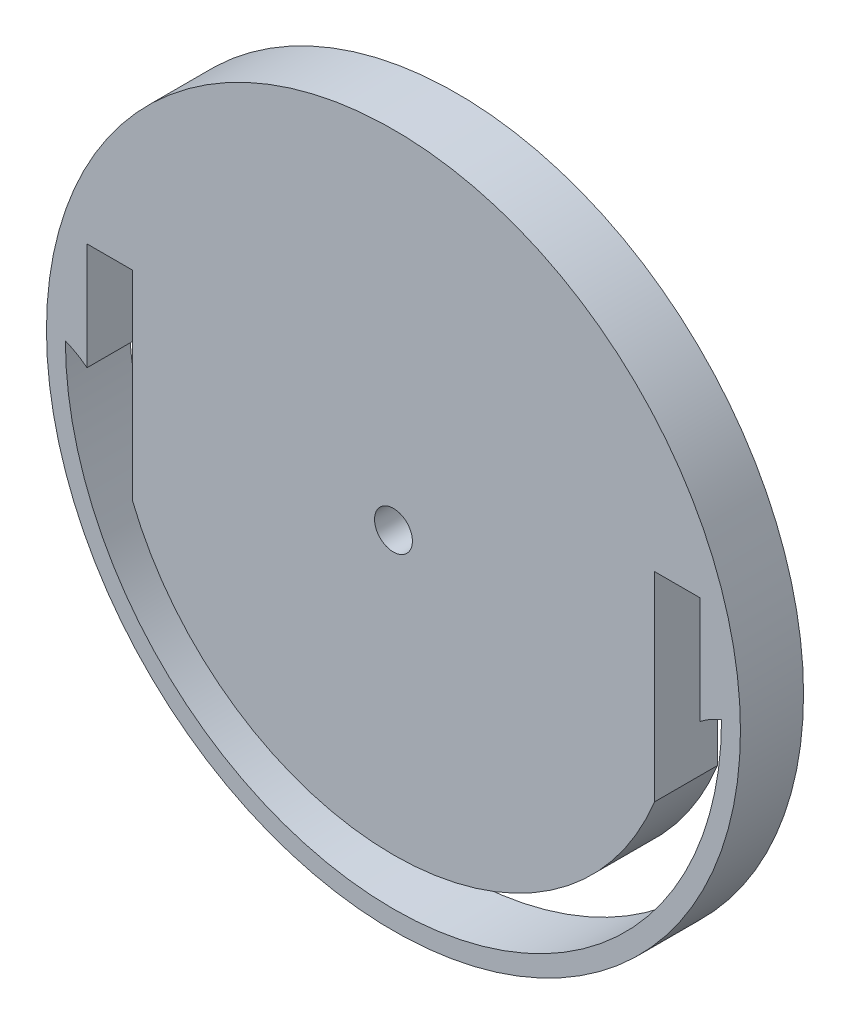
ISO-10303-21;
HEADER;
FILE_DESCRIPTION(('STEP AP214'),'2;1');
FILE_NAME('part.step','',(''),(''),'','','');
FILE_SCHEMA(('AUTOMOTIVE_DESIGN { 1 0 10303 214 1 1 1 1 }'));
ENDSEC;
DATA;
#1=APPLICATION_CONTEXT('core data for automotive mechanical design processes');
#2=APPLICATION_PROTOCOL_DEFINITION('international standard','automotive_design',2000,#1);
#3=PRODUCT_CONTEXT('',#1,'mechanical');
#4=PRODUCT('Part','Part','',(#3));
#5=PRODUCT_RELATED_PRODUCT_CATEGORY('part','',(#4));
#6=PRODUCT_DEFINITION_FORMATION('','',#4);
#7=PRODUCT_DEFINITION_CONTEXT('part definition',#1,'design');
#8=PRODUCT_DEFINITION('design','',#6,#7);
#9=PRODUCT_DEFINITION_SHAPE('','',#8);
#10=(LENGTH_UNIT() NAMED_UNIT(*) SI_UNIT(.MILLI.,.METRE.));
#11=(NAMED_UNIT(*) PLANE_ANGLE_UNIT() SI_UNIT($,.RADIAN.));
#12=(NAMED_UNIT(*) SI_UNIT($,.STERADIAN.) SOLID_ANGLE_UNIT());
#13=UNCERTAINTY_MEASURE_WITH_UNIT(LENGTH_MEASURE(1.E-05),#10,'distance_accuracy_value','');
#14=(GEOMETRIC_REPRESENTATION_CONTEXT(3) GLOBAL_UNCERTAINTY_ASSIGNED_CONTEXT((#13)) GLOBAL_UNIT_ASSIGNED_CONTEXT((#10,
#11,#12)) REPRESENTATION_CONTEXT('',''));
#15=CARTESIAN_POINT('',(0.,0.,0.));
#16=DIRECTION('',(0.,0.,1.));
#17=DIRECTION('',(1.,0.,0.));
#18=AXIS2_PLACEMENT_3D('',#15,#16,#17);
#19=CARTESIAN_POINT('',(0.,0.,10.));
#20=DIRECTION('',(0.,0.,1.));
#21=DIRECTION('',(1.,0.,0.));
#22=AXIS2_PLACEMENT_3D('',#19,#20,#21);
#23=PLANE('',#22);
#24=CARTESIAN_POINT('',(-57.2847291763101,-13.1870036528318,10.));
#25=DIRECTION('',(0.,0.,1.));
#26=DIRECTION('',(1.,0.,0.));
#27=AXIS2_PLACEMENT_3D('',#24,#25,#26);
#28=CIRCLE('',#27,14.2065276477661);
#29=CARTESIAN_POINT('',(-48.5619502084647,-1.97368323090248,10.));
#30=VERTEX_POINT('',#29);
#31=CARTESIAN_POINT('',(-52.,0.,10.));
#32=VERTEX_POINT('',#31);
#33=EDGE_CURVE('E48',#30,#32,#28,.T.);
#34=ORIENTED_EDGE('',*,*,#33,.F.);
#35=DIRECTION('',(0.,-1.,0.));
#36=VECTOR('',#35,1.);
#37=CARTESIAN_POINT('',(-48.5619502084647,15.0195117266793,10.));
#38=LINE('',#37,#36);
#39=CARTESIAN_POINT('',(-48.5619502084647,15.0195117266793,10.));
#40=VERTEX_POINT('',#39);
#41=EDGE_CURVE('E129',#40,#30,#38,.T.);
#42=ORIENTED_EDGE('',*,*,#41,.F.);
#43=DIRECTION('',(-1.,0.,0.));
#44=VECTOR('',#43,1.);
#45=CARTESIAN_POINT('',(-48.5619502084647,15.0195117266793,10.));
#46=LINE('',#45,#44);
#47=CARTESIAN_POINT('',(-41.3619502084647,15.0195117266793,10.));
#48=VERTEX_POINT('',#47);
#49=EDGE_CURVE('E132',#48,#40,#46,.T.);
#50=ORIENTED_EDGE('',*,*,#49,.F.);
#51=DIRECTION('',(0.,1.,0.));
#52=VECTOR('',#51,1.);
#53=CARTESIAN_POINT('',(-41.3619502084647,15.0195117266793,10.));
#54=LINE('',#53,#52);
#55=CARTESIAN_POINT('',(-41.3619502084647,-16.6207117877179,10.));
#56=VERTEX_POINT('',#55);
#57=EDGE_CURVE('E172',#56,#48,#54,.T.);
#58=ORIENTED_EDGE('',*,*,#57,.F.);
#59=CARTESIAN_POINT('',(0.,0.,10.));
#60=DIRECTION('',(0.,0.,-1.));
#61=DIRECTION('',(1.,0.,0.));
#62=AXIS2_PLACEMENT_3D('',#59,#60,#61);
#63=CIRCLE('',#62,44.5764398015129);
#64=CARTESIAN_POINT('',(41.3619502084647,-16.6207117877179,10.));
#65=VERTEX_POINT('',#64);
#66=EDGE_CURVE('E169',#65,#56,#63,.T.);
#67=ORIENTED_EDGE('',*,*,#66,.F.);
#68=DIRECTION('',(0.,-1.,0.));
#69=VECTOR('',#68,1.);
#70=CARTESIAN_POINT('',(41.3619502084647,15.0195117266793,10.));
#71=LINE('',#70,#69);
#72=CARTESIAN_POINT('',(41.3619502084647,15.0195117266793,10.));
#73=VERTEX_POINT('',#72);
#74=EDGE_CURVE('E166',#73,#65,#71,.T.);
#75=ORIENTED_EDGE('',*,*,#74,.F.);
#76=DIRECTION('',(-1.,0.,0.));
#77=VECTOR('',#76,1.);
#78=CARTESIAN_POINT('',(48.5619502084647,15.0195117266793,10.));
#79=LINE('',#78,#77);
#80=CARTESIAN_POINT('',(48.5619502084647,15.0195117266793,10.));
#81=VERTEX_POINT('',#80);
#82=EDGE_CURVE('E163',#81,#73,#79,.T.);
#83=ORIENTED_EDGE('',*,*,#82,.F.);
#84=DIRECTION('',(0.,1.,0.));
#85=VECTOR('',#84,1.);
#86=CARTESIAN_POINT('',(48.5619502084647,15.0195117266793,10.));
#87=LINE('',#86,#85);
#88=CARTESIAN_POINT('',(48.5619502084647,-1.97368323090248,10.));
#89=VERTEX_POINT('',#88);
#90=EDGE_CURVE('E160',#89,#81,#87,.T.);
#91=ORIENTED_EDGE('',*,*,#90,.F.);
#92=CARTESIAN_POINT('',(57.2847291763101,-13.1870036528318,10.));
#93=DIRECTION('',(0.,0.,1.));
#94=DIRECTION('',(-1.,0.,0.));
#95=AXIS2_PLACEMENT_3D('',#92,#93,#94);
#96=CIRCLE('',#95,14.2065276477661);
#97=CARTESIAN_POINT('',(52.,0.,10.));
#98=VERTEX_POINT('',#97);
#99=EDGE_CURVE('E157',#98,#89,#96,.T.);
#100=ORIENTED_EDGE('',*,*,#99,.F.);
#101=CARTESIAN_POINT('',(0.,0.,10.));
#102=DIRECTION('',(0.,0.,1.));
#103=DIRECTION('',(1.,0.,0.));
#104=AXIS2_PLACEMENT_3D('',#101,#102,#103);
#105=CIRCLE('',#104,52.);
#106=EDGE_CURVE('E155',#32,#98,#105,.T.);
#107=ORIENTED_EDGE('',*,*,#106,.F.);
#108=EDGE_LOOP('',(#34,#42,#50,#58,#67,#75,#83,#91,#100,#107));
#109=FACE_BOUND('',#108,.T.);
#110=CARTESIAN_POINT('',(0.,0.,10.));
#111=DIRECTION('',(0.,0.,1.));
#112=DIRECTION('',(1.,0.,0.));
#113=AXIS2_PLACEMENT_3D('',#110,#111,#112);
#114=CIRCLE('',#113,55.);
#115=CARTESIAN_POINT('',(55.,0.,10.));
#116=VERTEX_POINT('',#115);
#117=EDGE_CURVE('E11',#116,#116,#114,.T.);
#118=ORIENTED_EDGE('',*,*,#117,.T.);
#119=EDGE_LOOP('',(#118));
#120=FACE_BOUND('',#119,.T.);
#121=CARTESIAN_POINT('',(0.,0.,10.));
#122=DIRECTION('',(0.,0.,1.));
#123=DIRECTION('',(1.,0.,0.));
#124=AXIS2_PLACEMENT_3D('',#121,#122,#123);
#125=CIRCLE('',#124,3.);
#126=CARTESIAN_POINT('',(3.,0.,10.));
#127=VERTEX_POINT('',#126);
#128=EDGE_CURVE('E195',#127,#127,#125,.T.);
#129=ORIENTED_EDGE('',*,*,#128,.F.);
#130=EDGE_LOOP('',(#129));
#131=FACE_BOUND('',#130,.T.);
#132=ADVANCED_FACE('F33',(#109,#120,#131),#23,.T.);
#133=CARTESIAN_POINT('',(0.,0.,0.));
#134=DIRECTION('',(0.,0.,1.));
#135=DIRECTION('',(1.,0.,0.));
#136=AXIS2_PLACEMENT_3D('',#133,#134,#135);
#137=PLANE('',#136);
#138=DIRECTION('',(0.,-1.,0.));
#139=VECTOR('',#138,1.);
#140=CARTESIAN_POINT('',(-48.5619502084647,15.0195117266793,0.));
#141=LINE('',#140,#139);
#142=CARTESIAN_POINT('',(-48.5619502084647,15.0195117266793,0.));
#143=VERTEX_POINT('',#142);
#144=CARTESIAN_POINT('',(-48.5619502084647,-1.97368323090248,0.));
#145=VERTEX_POINT('',#144);
#146=EDGE_CURVE('E118',#143,#145,#141,.T.);
#147=ORIENTED_EDGE('',*,*,#146,.T.);
#148=CARTESIAN_POINT('',(-57.2847291763101,-13.1870036528318,0.));
#149=DIRECTION('',(0.,0.,1.));
#150=DIRECTION('',(1.,0.,0.));
#151=AXIS2_PLACEMENT_3D('',#148,#149,#150);
#152=CIRCLE('',#151,14.2065276477661);
#153=CARTESIAN_POINT('',(-52.,0.,0.));
#154=VERTEX_POINT('',#153);
#155=EDGE_CURVE('E112',#145,#154,#152,.T.);
#156=ORIENTED_EDGE('',*,*,#155,.T.);
#157=CARTESIAN_POINT('',(0.,0.,0.));
#158=DIRECTION('',(0.,0.,1.));
#159=DIRECTION('',(1.,0.,0.));
#160=AXIS2_PLACEMENT_3D('',#157,#158,#159);
#161=CIRCLE('',#160,52.);
#162=CARTESIAN_POINT('',(52.,0.,0.));
#163=VERTEX_POINT('',#162);
#164=EDGE_CURVE('E121',#154,#163,#161,.T.);
#165=ORIENTED_EDGE('',*,*,#164,.T.);
#166=CARTESIAN_POINT('',(57.2847291763101,-13.1870036528318,0.));
#167=DIRECTION('',(0.,0.,1.));
#168=DIRECTION('',(-1.,0.,0.));
#169=AXIS2_PLACEMENT_3D('',#166,#167,#168);
#170=CIRCLE('',#169,14.2065276477661);
#171=CARTESIAN_POINT('',(48.5619502084647,-1.97368323090248,0.));
#172=VERTEX_POINT('',#171);
#173=EDGE_CURVE('E56',#163,#172,#170,.T.);
#174=ORIENTED_EDGE('',*,*,#173,.T.);
#175=DIRECTION('',(0.,1.,0.));
#176=VECTOR('',#175,1.);
#177=CARTESIAN_POINT('',(48.5619502084647,15.0195117266793,0.));
#178=LINE('',#177,#176);
#179=CARTESIAN_POINT('',(48.5619502084647,15.0195117266793,0.));
#180=VERTEX_POINT('',#179);
#181=EDGE_CURVE('E136',#172,#180,#178,.T.);
#182=ORIENTED_EDGE('',*,*,#181,.T.);
#183=DIRECTION('',(-1.,0.,0.));
#184=VECTOR('',#183,1.);
#185=CARTESIAN_POINT('',(48.5619502084647,15.0195117266793,0.));
#186=LINE('',#185,#184);
#187=CARTESIAN_POINT('',(41.3619502084647,15.0195117266793,0.));
#188=VERTEX_POINT('',#187);
#189=EDGE_CURVE('E139',#180,#188,#186,.T.);
#190=ORIENTED_EDGE('',*,*,#189,.T.);
#191=DIRECTION('',(0.,-1.,0.));
#192=VECTOR('',#191,1.);
#193=CARTESIAN_POINT('',(41.3619502084647,15.0195117266793,0.));
#194=LINE('',#193,#192);
#195=CARTESIAN_POINT('',(41.3619502084647,-16.6207117877179,0.));
#196=VERTEX_POINT('',#195);
#197=EDGE_CURVE('E142',#188,#196,#194,.T.);
#198=ORIENTED_EDGE('',*,*,#197,.T.);
#199=CARTESIAN_POINT('',(0.,0.,0.));
#200=DIRECTION('',(0.,0.,-1.));
#201=DIRECTION('',(1.,0.,0.));
#202=AXIS2_PLACEMENT_3D('',#199,#200,#201);
#203=CIRCLE('',#202,44.5764398015129);
#204=CARTESIAN_POINT('',(-41.3619502084647,-16.6207117877179,0.));
#205=VERTEX_POINT('',#204);
#206=EDGE_CURVE('E145',#196,#205,#203,.T.);
#207=ORIENTED_EDGE('',*,*,#206,.T.);
#208=DIRECTION('',(0.,1.,0.));
#209=VECTOR('',#208,1.);
#210=CARTESIAN_POINT('',(-41.3619502084647,15.0195117266793,0.));
#211=LINE('',#210,#209);
#212=CARTESIAN_POINT('',(-41.3619502084647,15.0195117266793,0.));
#213=VERTEX_POINT('',#212);
#214=EDGE_CURVE('E148',#205,#213,#211,.T.);
#215=ORIENTED_EDGE('',*,*,#214,.T.);
#216=DIRECTION('',(-1.,0.,0.));
#217=VECTOR('',#216,1.);
#218=CARTESIAN_POINT('',(-48.5619502084647,15.0195117266793,0.));
#219=LINE('',#218,#217);
#220=EDGE_CURVE('E151',#213,#143,#219,.T.);
#221=ORIENTED_EDGE('',*,*,#220,.T.);
#222=EDGE_LOOP('',(#147,#156,#165,#174,#182,#190,#198,#207,#215,#221));
#223=FACE_BOUND('',#222,.T.);
#224=CARTESIAN_POINT('',(0.,0.,0.));
#225=DIRECTION('',(0.,0.,1.));
#226=DIRECTION('',(1.,0.,0.));
#227=AXIS2_PLACEMENT_3D('',#224,#225,#226);
#228=CIRCLE('',#227,55.);
#229=CARTESIAN_POINT('',(55.,0.,0.));
#230=VERTEX_POINT('',#229);
#231=EDGE_CURVE('E37',#230,#230,#228,.T.);
#232=ORIENTED_EDGE('',*,*,#231,.F.);
#233=EDGE_LOOP('',(#232));
#234=FACE_BOUND('',#233,.T.);
#235=CARTESIAN_POINT('',(0.,0.,0.));
#236=DIRECTION('',(0.,0.,1.));
#237=DIRECTION('',(1.,0.,0.));
#238=AXIS2_PLACEMENT_3D('',#235,#236,#237);
#239=CIRCLE('',#238,3.);
#240=CARTESIAN_POINT('',(3.,0.,0.));
#241=VERTEX_POINT('',#240);
#242=EDGE_CURVE('E179',#241,#241,#239,.T.);
#243=ORIENTED_EDGE('',*,*,#242,.T.);
#244=EDGE_LOOP('',(#243));
#245=FACE_BOUND('',#244,.T.);
#246=ADVANCED_FACE('F125',(#223,#234,#245),#137,.F.);
#247=CARTESIAN_POINT('',(0.,0.,10.));
#248=DIRECTION('',(0.,0.,-1.));
#249=DIRECTION('',(-1.,0.,0.));
#250=AXIS2_PLACEMENT_3D('',#247,#248,#249);
#251=CYLINDRICAL_SURFACE('',#250,55.);
#252=ORIENTED_EDGE('',*,*,#117,.F.);
#253=EDGE_LOOP('',(#252));
#254=FACE_BOUND('',#253,.T.);
#255=ORIENTED_EDGE('',*,*,#231,.T.);
#256=EDGE_LOOP('',(#255));
#257=FACE_BOUND('',#256,.T.);
#258=ADVANCED_FACE('F35',(#254,#257),#251,.T.);
#259=CARTESIAN_POINT('',(0.,0.,10.));
#260=DIRECTION('',(0.,0.,-1.));
#261=DIRECTION('',(-1.,0.,0.));
#262=AXIS2_PLACEMENT_3D('',#259,#260,#261);
#263=CYLINDRICAL_SURFACE('',#262,3.);
#264=ORIENTED_EDGE('',*,*,#128,.T.);
#265=EDGE_LOOP('',(#264));
#266=FACE_BOUND('',#265,.T.);
#267=ORIENTED_EDGE('',*,*,#242,.F.);
#268=EDGE_LOOP('',(#267));
#269=FACE_BOUND('',#268,.T.);
#270=ADVANCED_FACE('F202',(#266,#269),#263,.F.);
#271=CARTESIAN_POINT('',(-57.2847291763101,-13.1870036528318,0.));
#272=DIRECTION('',(0.,0.,1.));
#273=DIRECTION('',(1.,0.,0.));
#274=AXIS2_PLACEMENT_3D('',#271,#272,#273);
#275=CYLINDRICAL_SURFACE('',#274,14.2065276477661);
#276=ORIENTED_EDGE('',*,*,#33,.T.);
#277=DIRECTION('',(0.,0.,1.));
#278=VECTOR('',#277,1.);
#279=CARTESIAN_POINT('',(-52.,0.,0.));
#280=LINE('',#279,#278);
#281=EDGE_CURVE('E108',#154,#32,#280,.T.);
#282=ORIENTED_EDGE('',*,*,#281,.F.);
#283=ORIENTED_EDGE('',*,*,#155,.F.);
#284=DIRECTION('',(0.,0.,1.));
#285=VECTOR('',#284,1.);
#286=CARTESIAN_POINT('',(-48.5619502084647,-1.97368323090248,0.));
#287=LINE('',#286,#285);
#288=EDGE_CURVE('E177',#145,#30,#287,.T.);
#289=ORIENTED_EDGE('',*,*,#288,.T.);
#290=EDGE_LOOP('',(#276,#282,#283,#289));
#291=FACE_BOUND('',#290,.T.);
#292=ADVANCED_FACE('F110',(#291),#275,.F.);
#293=CARTESIAN_POINT('',(-48.5619502084647,15.0195117266793,0.));
#294=DIRECTION('',(-1.,0.,0.));
#295=DIRECTION('',(0.,0.,1.));
#296=AXIS2_PLACEMENT_3D('',#293,#294,#295);
#297=PLANE('',#296);
#298=ORIENTED_EDGE('',*,*,#41,.T.);
#299=ORIENTED_EDGE('',*,*,#288,.F.);
#300=ORIENTED_EDGE('',*,*,#146,.F.);
#301=DIRECTION('',(0.,0.,1.));
#302=VECTOR('',#301,1.);
#303=CARTESIAN_POINT('',(-48.5619502084647,15.0195117266793,0.));
#304=LINE('',#303,#302);
#305=EDGE_CURVE('E180',#143,#40,#304,.T.);
#306=ORIENTED_EDGE('',*,*,#305,.T.);
#307=EDGE_LOOP('',(#298,#299,#300,#306));
#308=FACE_BOUND('',#307,.T.);
#309=ADVANCED_FACE('F210',(#308),#297,.F.);
#310=CARTESIAN_POINT('',(-48.5619502084647,15.0195117266793,0.));
#311=DIRECTION('',(0.,1.,0.));
#312=DIRECTION('',(0.,0.,1.));
#313=AXIS2_PLACEMENT_3D('',#310,#311,#312);
#314=PLANE('',#313);
#315=ORIENTED_EDGE('',*,*,#49,.T.);
#316=ORIENTED_EDGE('',*,*,#305,.F.);
#317=ORIENTED_EDGE('',*,*,#220,.F.);
#318=DIRECTION('',(0.,0.,1.));
#319=VECTOR('',#318,1.);
#320=CARTESIAN_POINT('',(-41.3619502084647,15.0195117266793,0.));
#321=LINE('',#320,#319);
#322=EDGE_CURVE('E182',#213,#48,#321,.T.);
#323=ORIENTED_EDGE('',*,*,#322,.T.);
#324=EDGE_LOOP('',(#315,#316,#317,#323));
#325=FACE_BOUND('',#324,.T.);
#326=ADVANCED_FACE('F252',(#325),#314,.F.);
#327=CARTESIAN_POINT('',(-41.3619502084647,15.0195117266793,0.));
#328=DIRECTION('',(1.,0.,0.));
#329=DIRECTION('',(0.,0.,-1.));
#330=AXIS2_PLACEMENT_3D('',#327,#328,#329);
#331=PLANE('',#330);
#332=ORIENTED_EDGE('',*,*,#57,.T.);
#333=ORIENTED_EDGE('',*,*,#322,.F.);
#334=ORIENTED_EDGE('',*,*,#214,.F.);
#335=DIRECTION('',(0.,0.,1.));
#336=VECTOR('',#335,1.);
#337=CARTESIAN_POINT('',(-41.3619502084647,-16.6207117877179,0.));
#338=LINE('',#337,#336);
#339=EDGE_CURVE('E184',#205,#56,#338,.T.);
#340=ORIENTED_EDGE('',*,*,#339,.T.);
#341=EDGE_LOOP('',(#332,#333,#334,#340));
#342=FACE_BOUND('',#341,.T.);
#343=ADVANCED_FACE('F249',(#342),#331,.F.);
#344=CARTESIAN_POINT('',(0.,0.,0.));
#345=DIRECTION('',(0.,0.,1.));
#346=DIRECTION('',(1.,0.,0.));
#347=AXIS2_PLACEMENT_3D('',#344,#345,#346);
#348=CYLINDRICAL_SURFACE('',#347,44.5764398015129);
#349=ORIENTED_EDGE('',*,*,#66,.T.);
#350=ORIENTED_EDGE('',*,*,#339,.F.);
#351=ORIENTED_EDGE('',*,*,#206,.F.);
#352=DIRECTION('',(0.,0.,1.));
#353=VECTOR('',#352,1.);
#354=CARTESIAN_POINT('',(41.3619502084647,-16.6207117877179,0.));
#355=LINE('',#354,#353);
#356=EDGE_CURVE('E186',#196,#65,#355,.T.);
#357=ORIENTED_EDGE('',*,*,#356,.T.);
#358=EDGE_LOOP('',(#349,#350,#351,#357));
#359=FACE_BOUND('',#358,.T.);
#360=ADVANCED_FACE('F245',(#359),#348,.T.);
#361=CARTESIAN_POINT('',(41.3619502084647,15.0195117266793,0.));
#362=DIRECTION('',(-1.,0.,0.));
#363=DIRECTION('',(0.,0.,1.));
#364=AXIS2_PLACEMENT_3D('',#361,#362,#363);
#365=PLANE('',#364);
#366=ORIENTED_EDGE('',*,*,#74,.T.);
#367=ORIENTED_EDGE('',*,*,#356,.F.);
#368=ORIENTED_EDGE('',*,*,#197,.F.);
#369=DIRECTION('',(0.,0.,1.));
#370=VECTOR('',#369,1.);
#371=CARTESIAN_POINT('',(41.3619502084647,15.0195117266793,0.));
#372=LINE('',#371,#370);
#373=EDGE_CURVE('E188',#188,#73,#372,.T.);
#374=ORIENTED_EDGE('',*,*,#373,.T.);
#375=EDGE_LOOP('',(#366,#367,#368,#374));
#376=FACE_BOUND('',#375,.T.);
#377=ADVANCED_FACE('F241',(#376),#365,.F.);
#378=CARTESIAN_POINT('',(48.5619502084647,15.0195117266793,0.));
#379=DIRECTION('',(0.,1.,0.));
#380=DIRECTION('',(0.,0.,1.));
#381=AXIS2_PLACEMENT_3D('',#378,#379,#380);
#382=PLANE('',#381);
#383=ORIENTED_EDGE('',*,*,#82,.T.);
#384=ORIENTED_EDGE('',*,*,#373,.F.);
#385=ORIENTED_EDGE('',*,*,#189,.F.);
#386=DIRECTION('',(0.,0.,1.));
#387=VECTOR('',#386,1.);
#388=CARTESIAN_POINT('',(48.5619502084647,15.0195117266793,0.));
#389=LINE('',#388,#387);
#390=EDGE_CURVE('E190',#180,#81,#389,.T.);
#391=ORIENTED_EDGE('',*,*,#390,.T.);
#392=EDGE_LOOP('',(#383,#384,#385,#391));
#393=FACE_BOUND('',#392,.T.);
#394=ADVANCED_FACE('F238',(#393),#382,.F.);
#395=CARTESIAN_POINT('',(48.5619502084647,15.0195117266793,0.));
#396=DIRECTION('',(1.,0.,0.));
#397=DIRECTION('',(0.,0.,-1.));
#398=AXIS2_PLACEMENT_3D('',#395,#396,#397);
#399=PLANE('',#398);
#400=ORIENTED_EDGE('',*,*,#90,.T.);
#401=ORIENTED_EDGE('',*,*,#390,.F.);
#402=ORIENTED_EDGE('',*,*,#181,.F.);
#403=DIRECTION('',(0.,0.,1.));
#404=VECTOR('',#403,1.);
#405=CARTESIAN_POINT('',(48.5619502084647,-1.97368323090248,0.));
#406=LINE('',#405,#404);
#407=EDGE_CURVE('E192',#172,#89,#406,.T.);
#408=ORIENTED_EDGE('',*,*,#407,.T.);
#409=EDGE_LOOP('',(#400,#401,#402,#408));
#410=FACE_BOUND('',#409,.T.);
#411=ADVANCED_FACE('F234',(#410),#399,.F.);
#412=CARTESIAN_POINT('',(57.2847291763101,-13.1870036528318,0.));
#413=DIRECTION('',(0.,0.,1.));
#414=DIRECTION('',(1.,0.,0.));
#415=AXIS2_PLACEMENT_3D('',#412,#413,#414);
#416=CYLINDRICAL_SURFACE('',#415,14.2065276477661);
#417=ORIENTED_EDGE('',*,*,#99,.T.);
#418=ORIENTED_EDGE('',*,*,#407,.F.);
#419=ORIENTED_EDGE('',*,*,#173,.F.);
#420=DIRECTION('',(0.,0.,1.));
#421=VECTOR('',#420,1.);
#422=CARTESIAN_POINT('',(52.,0.,0.));
#423=LINE('',#422,#421);
#424=EDGE_CURVE('E117',#163,#98,#423,.T.);
#425=ORIENTED_EDGE('',*,*,#424,.T.);
#426=EDGE_LOOP('',(#417,#418,#419,#425));
#427=FACE_BOUND('',#426,.T.);
#428=ADVANCED_FACE('F231',(#427),#416,.F.);
#429=CARTESIAN_POINT('',(0.,0.,0.));
#430=DIRECTION('',(0.,0.,1.));
#431=DIRECTION('',(1.,0.,0.));
#432=AXIS2_PLACEMENT_3D('',#429,#430,#431);
#433=CYLINDRICAL_SURFACE('',#432,52.);
#434=ORIENTED_EDGE('',*,*,#106,.T.);
#435=ORIENTED_EDGE('',*,*,#424,.F.);
#436=ORIENTED_EDGE('',*,*,#164,.F.);
#437=ORIENTED_EDGE('',*,*,#281,.T.);
#438=EDGE_LOOP('',(#434,#435,#436,#437));
#439=FACE_BOUND('',#438,.T.);
#440=ADVANCED_FACE('F122',(#439),#433,.F.);
#441=CLOSED_SHELL('',(#132,#246,#258,#270,#292,#309,#326,#343,#360,#377,#394,#411,#428,#440));
#442=MANIFOLD_SOLID_BREP('B2',#441);
#443=ADVANCED_BREP_SHAPE_REPRESENTATION('',(#18,#442),#14);
#444=SHAPE_DEFINITION_REPRESENTATION(#9,#443);
ENDSEC;
END-ISO-10303-21;
